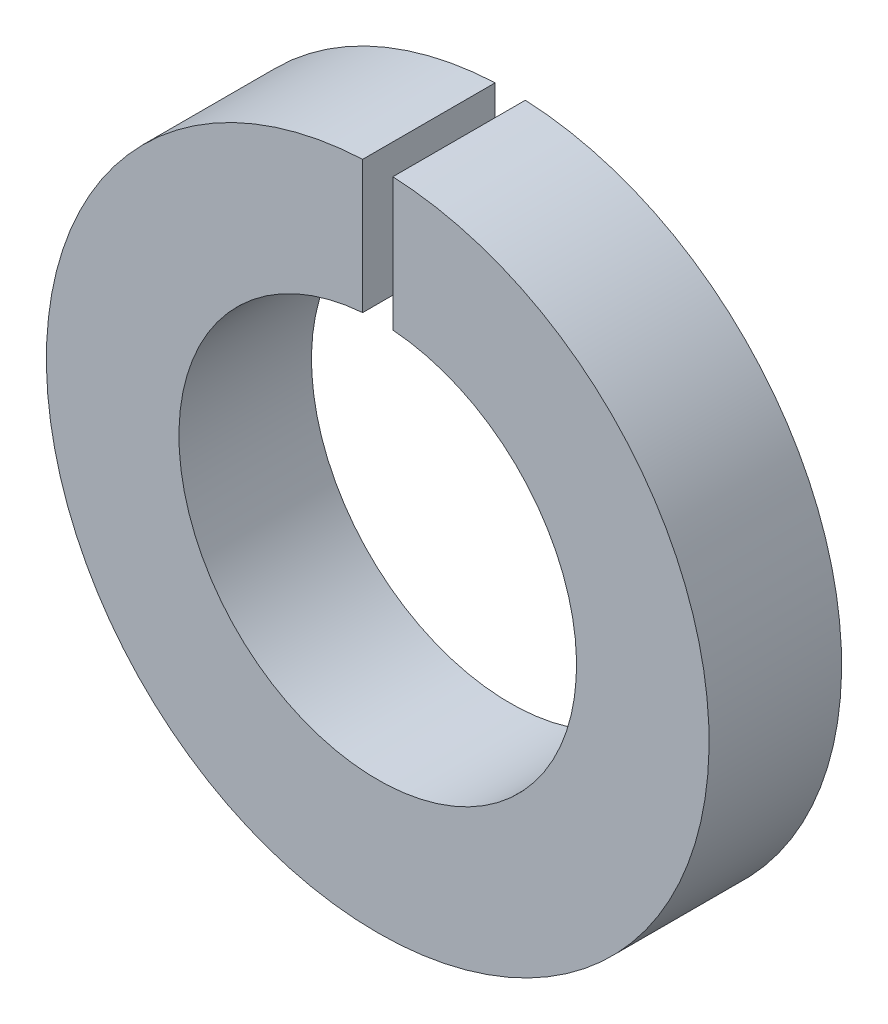
ISO-10303-21;
HEADER;
FILE_DESCRIPTION(('STEP AP214'),'2;1');
FILE_NAME('part.step','',(''),(''),'','','');
FILE_SCHEMA(('AUTOMOTIVE_DESIGN { 1 0 10303 214 1 1 1 1 }'));
ENDSEC;
DATA;
#1=APPLICATION_CONTEXT('core data for automotive mechanical design processes');
#2=APPLICATION_PROTOCOL_DEFINITION('international standard','automotive_design',2000,#1);
#3=PRODUCT_CONTEXT('',#1,'mechanical');
#4=PRODUCT('Part','Part','',(#3));
#5=PRODUCT_RELATED_PRODUCT_CATEGORY('part','',(#4));
#6=PRODUCT_DEFINITION_FORMATION('','',#4);
#7=PRODUCT_DEFINITION_CONTEXT('part definition',#1,'design');
#8=PRODUCT_DEFINITION('design','',#6,#7);
#9=PRODUCT_DEFINITION_SHAPE('','',#8);
#10=(LENGTH_UNIT() NAMED_UNIT(*) SI_UNIT(.MILLI.,.METRE.));
#11=(NAMED_UNIT(*) PLANE_ANGLE_UNIT() SI_UNIT($,.RADIAN.));
#12=(NAMED_UNIT(*) SI_UNIT($,.STERADIAN.) SOLID_ANGLE_UNIT());
#13=UNCERTAINTY_MEASURE_WITH_UNIT(LENGTH_MEASURE(1.E-05),#10,'distance_accuracy_value','');
#14=(GEOMETRIC_REPRESENTATION_CONTEXT(3) GLOBAL_UNCERTAINTY_ASSIGNED_CONTEXT((#13)) GLOBAL_UNIT_ASSIGNED_CONTEXT((#10,
#11,#12)) REPRESENTATION_CONTEXT('',''));
#15=CARTESIAN_POINT('',(0.,0.,0.));
#16=DIRECTION('',(0.,0.,1.));
#17=DIRECTION('',(1.,0.,0.));
#18=AXIS2_PLACEMENT_3D('',#15,#16,#17);
#19=CARTESIAN_POINT('',(0.,0.,0.7));
#20=DIRECTION('',(0.,0.,1.));
#21=DIRECTION('',(1.,0.,0.));
#22=AXIS2_PLACEMENT_3D('',#19,#20,#21);
#23=PLANE('',#22);
#24=CARTESIAN_POINT('',(0.,0.,0.7));
#25=DIRECTION('',(0.,0.,1.));
#26=DIRECTION('',(1.,0.,0.));
#27=AXIS2_PLACEMENT_3D('',#24,#25,#26);
#28=CIRCLE('',#27,1.75);
#29=CARTESIAN_POINT('',(-0.0796245698493442,1.74818761232206,0.7));
#30=VERTEX_POINT('',#29);
#31=CARTESIAN_POINT('',(0.0796245698493463,1.74818761232206,0.7));
#32=VERTEX_POINT('',#31);
#33=EDGE_CURVE('E98',#30,#32,#28,.T.);
#34=ORIENTED_EDGE('',*,*,#33,.T.);
#35=DIRECTION('',(0.,-1.,0.));
#36=VECTOR('',#35,1.);
#37=CARTESIAN_POINT('',(0.0796245698493463,0.,0.7));
#38=LINE('',#37,#36);
#39=CARTESIAN_POINT('',(0.0796245698493463,1.04697656510368,0.7));
#40=VERTEX_POINT('',#39);
#41=EDGE_CURVE('E84',#32,#40,#38,.T.);
#42=ORIENTED_EDGE('',*,*,#41,.T.);
#43=CARTESIAN_POINT('',(0.,0.,0.7));
#44=DIRECTION('',(0.,0.,1.));
#45=DIRECTION('',(1.,0.,0.));
#46=AXIS2_PLACEMENT_3D('',#43,#44,#45);
#47=CIRCLE('',#46,1.05);
#48=CARTESIAN_POINT('',(-0.0796245698493442,1.04697656510368,0.7));
#49=VERTEX_POINT('',#48);
#50=EDGE_CURVE('E108',#49,#40,#47,.T.);
#51=ORIENTED_EDGE('',*,*,#50,.F.);
#52=DIRECTION('',(0.,1.,0.));
#53=VECTOR('',#52,1.);
#54=CARTESIAN_POINT('',(-0.0796245698493442,0.,0.7));
#55=LINE('',#54,#53);
#56=EDGE_CURVE('E68',#49,#30,#55,.T.);
#57=ORIENTED_EDGE('',*,*,#56,.T.);
#58=EDGE_LOOP('',(#34,#42,#51,#57));
#59=FACE_BOUND('',#58,.T.);
#60=ADVANCED_FACE('F43',(#59),#23,.T.);
#61=CARTESIAN_POINT('',(0.,0.,0.));
#62=DIRECTION('',(0.,0.,1.));
#63=DIRECTION('',(1.,0.,0.));
#64=AXIS2_PLACEMENT_3D('',#61,#62,#63);
#65=PLANE('',#64);
#66=DIRECTION('',(0.,-1.,0.));
#67=VECTOR('',#66,1.);
#68=CARTESIAN_POINT('',(0.0796245698493463,0.,0.));
#69=LINE('',#68,#67);
#70=CARTESIAN_POINT('',(0.0796245698493463,1.74818761232206,0.));
#71=VERTEX_POINT('',#70);
#72=CARTESIAN_POINT('',(0.0796245698493463,1.04697656510368,0.));
#73=VERTEX_POINT('',#72);
#74=EDGE_CURVE('E59',#71,#73,#69,.T.);
#75=ORIENTED_EDGE('',*,*,#74,.F.);
#76=CARTESIAN_POINT('',(0.,0.,0.));
#77=DIRECTION('',(0.,0.,1.));
#78=DIRECTION('',(1.,0.,0.));
#79=AXIS2_PLACEMENT_3D('',#76,#77,#78);
#80=CIRCLE('',#79,1.75);
#81=CARTESIAN_POINT('',(-0.0796245698493442,1.74818761232206,0.));
#82=VERTEX_POINT('',#81);
#83=EDGE_CURVE('E100',#82,#71,#80,.T.);
#84=ORIENTED_EDGE('',*,*,#83,.F.);
#85=DIRECTION('',(0.,1.,0.));
#86=VECTOR('',#85,1.);
#87=CARTESIAN_POINT('',(-0.0796245698493442,0.,0.));
#88=LINE('',#87,#86);
#89=CARTESIAN_POINT('',(-0.0796245698493442,1.04697656510368,0.));
#90=VERTEX_POINT('',#89);
#91=EDGE_CURVE('E119',#90,#82,#88,.T.);
#92=ORIENTED_EDGE('',*,*,#91,.F.);
#93=CARTESIAN_POINT('',(0.,0.,0.));
#94=DIRECTION('',(0.,0.,1.));
#95=DIRECTION('',(1.,0.,0.));
#96=AXIS2_PLACEMENT_3D('',#93,#94,#95);
#97=CIRCLE('',#96,1.05);
#98=EDGE_CURVE('E111',#90,#73,#97,.T.);
#99=ORIENTED_EDGE('',*,*,#98,.T.);
#100=EDGE_LOOP('',(#75,#84,#92,#99));
#101=FACE_BOUND('',#100,.T.);
#102=ADVANCED_FACE('F128',(#101),#65,.F.);
#103=CARTESIAN_POINT('',(0.,0.,0.7));
#104=DIRECTION('',(0.,0.,-1.));
#105=DIRECTION('',(-1.,0.,0.));
#106=AXIS2_PLACEMENT_3D('',#103,#104,#105);
#107=CYLINDRICAL_SURFACE('',#106,1.75);
#108=DIRECTION('',(0.,0.,1.));
#109=VECTOR('',#108,1.);
#110=CARTESIAN_POINT('',(0.0796245698493463,1.74818761232206,-0.3));
#111=LINE('',#110,#109);
#112=EDGE_CURVE('E87',#71,#32,#111,.T.);
#113=ORIENTED_EDGE('',*,*,#112,.T.);
#114=ORIENTED_EDGE('',*,*,#33,.F.);
#115=DIRECTION('',(0.,0.,1.));
#116=VECTOR('',#115,1.);
#117=CARTESIAN_POINT('',(-0.0796245698493442,1.74818761232206,-0.3));
#118=LINE('',#117,#116);
#119=EDGE_CURVE('E102',#82,#30,#118,.T.);
#120=ORIENTED_EDGE('',*,*,#119,.F.);
#121=ORIENTED_EDGE('',*,*,#83,.T.);
#122=EDGE_LOOP('',(#113,#114,#120,#121));
#123=FACE_BOUND('',#122,.T.);
#124=ADVANCED_FACE('F45',(#123),#107,.T.);
#125=CARTESIAN_POINT('',(0.,0.,0.7));
#126=DIRECTION('',(0.,0.,-1.));
#127=DIRECTION('',(-1.,0.,0.));
#128=AXIS2_PLACEMENT_3D('',#125,#126,#127);
#129=CYLINDRICAL_SURFACE('',#128,1.05);
#130=ORIENTED_EDGE('',*,*,#50,.T.);
#131=DIRECTION('',(0.,0.,-1.));
#132=VECTOR('',#131,1.);
#133=CARTESIAN_POINT('',(0.0796245698493463,1.04697656510368,0.7));
#134=LINE('',#133,#132);
#135=EDGE_CURVE('E11',#40,#73,#134,.T.);
#136=ORIENTED_EDGE('',*,*,#135,.T.);
#137=ORIENTED_EDGE('',*,*,#98,.F.);
#138=DIRECTION('',(0.,0.,-1.));
#139=VECTOR('',#138,1.);
#140=CARTESIAN_POINT('',(-0.0796245698493442,1.04697656510368,0.7));
#141=LINE('',#140,#139);
#142=EDGE_CURVE('E52',#90,#49,#141,.F.);
#143=ORIENTED_EDGE('',*,*,#142,.T.);
#144=EDGE_LOOP('',(#130,#136,#137,#143));
#145=FACE_BOUND('',#144,.T.);
#146=ADVANCED_FACE('F131',(#145),#129,.F.);
#147=CARTESIAN_POINT('',(-0.0796245698493442,0.,-0.3));
#148=DIRECTION('',(1.,0.,0.));
#149=DIRECTION('',(0.,0.,-1.));
#150=AXIS2_PLACEMENT_3D('',#147,#148,#149);
#151=PLANE('',#150);
#152=ORIENTED_EDGE('',*,*,#91,.T.);
#153=ORIENTED_EDGE('',*,*,#119,.T.);
#154=ORIENTED_EDGE('',*,*,#56,.F.);
#155=ORIENTED_EDGE('',*,*,#142,.F.);
#156=EDGE_LOOP('',(#152,#153,#154,#155));
#157=FACE_BOUND('',#156,.T.);
#158=ADVANCED_FACE('F125',(#157),#151,.T.);
#159=CARTESIAN_POINT('',(0.0796245698493463,0.,-0.3));
#160=DIRECTION('',(-1.,0.,0.));
#161=DIRECTION('',(0.,0.,1.));
#162=AXIS2_PLACEMENT_3D('',#159,#160,#161);
#163=PLANE('',#162);
#164=ORIENTED_EDGE('',*,*,#74,.T.);
#165=ORIENTED_EDGE('',*,*,#135,.F.);
#166=ORIENTED_EDGE('',*,*,#41,.F.);
#167=ORIENTED_EDGE('',*,*,#112,.F.);
#168=EDGE_LOOP('',(#164,#165,#166,#167));
#169=FACE_BOUND('',#168,.T.);
#170=ADVANCED_FACE('F86',(#169),#163,.T.);
#171=CLOSED_SHELL('',(#60,#102,#124,#146,#158,#170));
#172=MANIFOLD_SOLID_BREP('B2',#171);
#173=ADVANCED_BREP_SHAPE_REPRESENTATION('',(#18,#172),#14);
#174=SHAPE_DEFINITION_REPRESENTATION(#9,#173);
ENDSEC;
END-ISO-10303-21;
